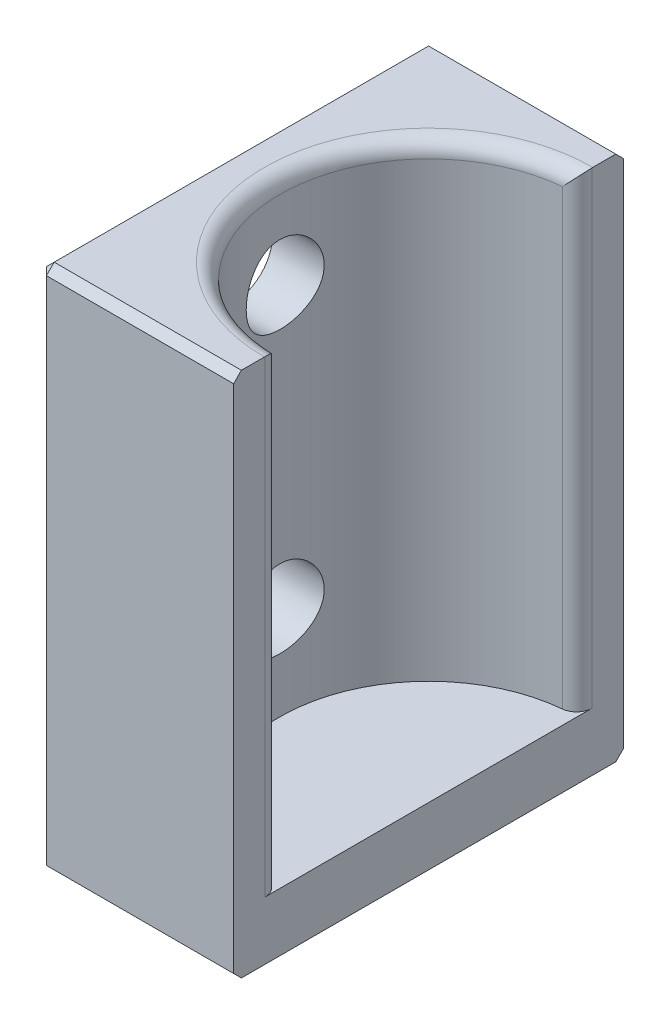
ISO-10303-21;
HEADER;
FILE_DESCRIPTION(('STEP AP214'),'2;1');
FILE_NAME('part.step','',(''),(''),'','','');
FILE_SCHEMA(('AUTOMOTIVE_DESIGN { 1 0 10303 214 1 1 1 1 }'));
ENDSEC;
DATA;
#1=APPLICATION_CONTEXT('core data for automotive mechanical design processes');
#2=APPLICATION_PROTOCOL_DEFINITION('international standard','automotive_design',2000,#1);
#3=PRODUCT_CONTEXT('',#1,'mechanical');
#4=PRODUCT('Part','Part','',(#3));
#5=PRODUCT_RELATED_PRODUCT_CATEGORY('part','',(#4));
#6=PRODUCT_DEFINITION_FORMATION('','',#4);
#7=PRODUCT_DEFINITION_CONTEXT('part definition',#1,'design');
#8=PRODUCT_DEFINITION('design','',#6,#7);
#9=PRODUCT_DEFINITION_SHAPE('','',#8);
#10=(LENGTH_UNIT() NAMED_UNIT(*) SI_UNIT(.MILLI.,.METRE.));
#11=(NAMED_UNIT(*) PLANE_ANGLE_UNIT() SI_UNIT($,.RADIAN.));
#12=(NAMED_UNIT(*) SI_UNIT($,.STERADIAN.) SOLID_ANGLE_UNIT());
#13=UNCERTAINTY_MEASURE_WITH_UNIT(LENGTH_MEASURE(1.E-05),#10,'distance_accuracy_value','');
#14=(GEOMETRIC_REPRESENTATION_CONTEXT(3) GLOBAL_UNCERTAINTY_ASSIGNED_CONTEXT((#13)) GLOBAL_UNIT_ASSIGNED_CONTEXT((#10,
#11,#12)) REPRESENTATION_CONTEXT('',''));
#15=CARTESIAN_POINT('',(0.,0.,0.));
#16=DIRECTION('',(0.,0.,1.));
#17=DIRECTION('',(1.,0.,0.));
#18=AXIS2_PLACEMENT_3D('',#15,#16,#17);
#19=CARTESIAN_POINT('',(-12.5,33.74,-12.5));
#20=DIRECTION('',(0.,0.,1.));
#21=DIRECTION('',(1.,0.,0.));
#22=AXIS2_PLACEMENT_3D('',#19,#20,#21);
#23=PLANE('',#22);
#24=DIRECTION('',(0.,1.,0.));
#25=VECTOR('',#24,1.);
#26=CARTESIAN_POINT('',(-12.,33.74,-12.5));
#27=LINE('',#26,#25);
#28=CARTESIAN_POINT('',(-12.,0.499999999999994,-12.5));
#29=VERTEX_POINT('',#28);
#30=CARTESIAN_POINT('',(-12.,33.24,-12.5));
#31=VERTEX_POINT('',#30);
#32=EDGE_CURVE('E384',#29,#31,#27,.T.);
#33=ORIENTED_EDGE('',*,*,#32,.T.);
#34=DIRECTION('',(1.,0.,0.));
#35=VECTOR('',#34,1.);
#36=CARTESIAN_POINT('',(-12.5,33.24,-12.5));
#37=LINE('',#36,#35);
#38=CARTESIAN_POINT('',(0.,33.24,-12.5));
#39=VERTEX_POINT('',#38);
#40=EDGE_CURVE('E381',#31,#39,#37,.T.);
#41=ORIENTED_EDGE('',*,*,#40,.T.);
#42=DIRECTION('',(0.,1.,0.));
#43=VECTOR('',#42,1.);
#44=CARTESIAN_POINT('',(0.,0.,-12.5));
#45=LINE('',#44,#43);
#46=CARTESIAN_POINT('',(0.,0.499999999999994,-12.5));
#47=VERTEX_POINT('',#46);
#48=EDGE_CURVE('E422',#47,#39,#45,.T.);
#49=ORIENTED_EDGE('',*,*,#48,.F.);
#50=DIRECTION('',(-1.,0.,0.));
#51=VECTOR('',#50,1.);
#52=CARTESIAN_POINT('',(-12.5,0.499999999999994,-12.5));
#53=LINE('',#52,#51);
#54=EDGE_CURVE('E388',#47,#29,#53,.T.);
#55=ORIENTED_EDGE('',*,*,#54,.T.);
#56=EDGE_LOOP('',(#33,#41,#49,#55));
#57=FACE_BOUND('',#56,.T.);
#58=ADVANCED_FACE('F36',(#57),#23,.F.);
#59=CARTESIAN_POINT('',(-12.5,33.74,12.5));
#60=DIRECTION('',(1.,0.,0.));
#61=DIRECTION('',(0.,0.,-1.));
#62=AXIS2_PLACEMENT_3D('',#59,#60,#61);
#63=PLANE('',#62);
#64=DIRECTION('',(0.,0.,-1.));
#65=VECTOR('',#64,1.);
#66=CARTESIAN_POINT('',(-12.5,33.24,12.5));
#67=LINE('',#66,#65);
#68=CARTESIAN_POINT('',(-12.5,33.24,12.));
#69=VERTEX_POINT('',#68);
#70=CARTESIAN_POINT('',(-12.5,33.24,-12.));
#71=VERTEX_POINT('',#70);
#72=EDGE_CURVE('E162',#69,#71,#67,.T.);
#73=ORIENTED_EDGE('',*,*,#72,.T.);
#74=DIRECTION('',(0.,-1.,0.));
#75=VECTOR('',#74,1.);
#76=CARTESIAN_POINT('',(-12.5,33.74,-12.));
#77=LINE('',#76,#75);
#78=CARTESIAN_POINT('',(-12.5,0.499999999999994,-12.));
#79=VERTEX_POINT('',#78);
#80=EDGE_CURVE('E158',#71,#79,#77,.T.);
#81=ORIENTED_EDGE('',*,*,#80,.T.);
#82=DIRECTION('',(0.,0.,1.));
#83=VECTOR('',#82,1.);
#84=CARTESIAN_POINT('',(-12.5,0.499999999999994,12.5));
#85=LINE('',#84,#83);
#86=CARTESIAN_POINT('',(-12.5,0.499999999999994,12.));
#87=VERTEX_POINT('',#86);
#88=EDGE_CURVE('E151',#79,#87,#85,.T.);
#89=ORIENTED_EDGE('',*,*,#88,.T.);
#90=DIRECTION('',(0.,1.,0.));
#91=VECTOR('',#90,1.);
#92=CARTESIAN_POINT('',(-12.5,33.74,12.));
#93=LINE('',#92,#91);
#94=EDGE_CURVE('E155',#87,#69,#93,.T.);
#95=ORIENTED_EDGE('',*,*,#94,.T.);
#96=EDGE_LOOP('',(#73,#81,#89,#95));
#97=FACE_BOUND('',#96,.T.);
#98=CARTESIAN_POINT('',(-12.5,27.74,0.));
#99=DIRECTION('',(-1.,0.,0.));
#100=DIRECTION('',(0.,0.,1.));
#101=AXIS2_PLACEMENT_3D('',#98,#99,#100);
#102=CIRCLE('',#101,2.5);
#103=CARTESIAN_POINT('',(-12.5,27.74,2.5));
#104=VERTEX_POINT('',#103);
#105=EDGE_CURVE('E434',#104,#104,#102,.T.);
#106=ORIENTED_EDGE('',*,*,#105,.F.);
#107=EDGE_LOOP('',(#106));
#108=FACE_BOUND('',#107,.T.);
#109=CARTESIAN_POINT('',(-12.5,9.73999999999999,0.));
#110=DIRECTION('',(-1.,0.,0.));
#111=DIRECTION('',(0.,0.,-1.));
#112=AXIS2_PLACEMENT_3D('',#109,#110,#111);
#113=CIRCLE('',#112,2.5);
#114=CARTESIAN_POINT('',(-12.5,9.73999999999999,-2.5));
#115=VERTEX_POINT('',#114);
#116=EDGE_CURVE('E200',#115,#115,#113,.T.);
#117=ORIENTED_EDGE('',*,*,#116,.F.);
#118=EDGE_LOOP('',(#117));
#119=FACE_BOUND('',#118,.T.);
#120=ADVANCED_FACE('F153',(#97,#108,#119),#63,.F.);
#121=CARTESIAN_POINT('',(-12.5,33.74,12.5));
#122=DIRECTION('',(0.,0.,-1.));
#123=DIRECTION('',(-1.,0.,0.));
#124=AXIS2_PLACEMENT_3D('',#121,#122,#123);
#125=PLANE('',#124);
#126=DIRECTION('',(0.,-1.,0.));
#127=VECTOR('',#126,1.);
#128=CARTESIAN_POINT('',(-12.,33.74,12.5));
#129=LINE('',#128,#127);
#130=CARTESIAN_POINT('',(-12.,33.24,12.5));
#131=VERTEX_POINT('',#130);
#132=CARTESIAN_POINT('',(-12.,0.5,12.5));
#133=VERTEX_POINT('',#132);
#134=EDGE_CURVE('E359',#131,#133,#129,.T.);
#135=ORIENTED_EDGE('',*,*,#134,.T.);
#136=DIRECTION('',(1.,0.,0.));
#137=VECTOR('',#136,1.);
#138=CARTESIAN_POINT('',(0.,0.5,12.5));
#139=LINE('',#138,#137);
#140=CARTESIAN_POINT('',(0.,0.5,12.5));
#141=VERTEX_POINT('',#140);
#142=EDGE_CURVE('E204',#133,#141,#139,.T.);
#143=ORIENTED_EDGE('',*,*,#142,.T.);
#144=DIRECTION('',(0.,1.,0.));
#145=VECTOR('',#144,1.);
#146=CARTESIAN_POINT('',(0.,0.,12.5));
#147=LINE('',#146,#145);
#148=CARTESIAN_POINT('',(0.,33.24,12.5));
#149=VERTEX_POINT('',#148);
#150=EDGE_CURVE('E420',#141,#149,#147,.T.);
#151=ORIENTED_EDGE('',*,*,#150,.T.);
#152=DIRECTION('',(-1.,0.,0.));
#153=VECTOR('',#152,1.);
#154=CARTESIAN_POINT('',(-12.5,33.24,12.5));
#155=LINE('',#154,#153);
#156=EDGE_CURVE('E338',#149,#131,#155,.T.);
#157=ORIENTED_EDGE('',*,*,#156,.T.);
#158=EDGE_LOOP('',(#135,#143,#151,#157));
#159=FACE_BOUND('',#158,.T.);
#160=ADVANCED_FACE('F244',(#159),#125,.F.);
#161=CARTESIAN_POINT('',(0.,33.74,0.));
#162=DIRECTION('',(0.,-1.,0.));
#163=DIRECTION('',(0.,0.,-1.));
#164=AXIS2_PLACEMENT_3D('',#161,#162,#163);
#165=PLANE('',#164);
#166=DIRECTION('',(0.,0.,1.));
#167=VECTOR('',#166,1.);
#168=CARTESIAN_POINT('',(0.,33.74,-12.5));
#169=LINE('',#168,#167);
#170=CARTESIAN_POINT('',(0.,33.74,10.525));
#171=VERTEX_POINT('',#170);
#172=CARTESIAN_POINT('',(0.,33.74,12.));
#173=VERTEX_POINT('',#172);
#174=EDGE_CURVE('E397',#171,#173,#169,.T.);
#175=ORIENTED_EDGE('',*,*,#174,.F.);
#176=CARTESIAN_POINT('',(0.,33.74,0.));
#177=DIRECTION('',(0.,-1.,0.));
#178=DIRECTION('',(0.,0.,-1.));
#179=AXIS2_PLACEMENT_3D('',#176,#177,#178);
#180=CIRCLE('',#179,10.525);
#181=CARTESIAN_POINT('',(0.,33.74,-10.525));
#182=VERTEX_POINT('',#181);
#183=EDGE_CURVE('E216',#171,#182,#180,.T.);
#184=ORIENTED_EDGE('',*,*,#183,.T.);
#185=CARTESIAN_POINT('',(0.,33.74,-12.));
#186=VERTEX_POINT('',#185);
#187=EDGE_CURVE('E400',#186,#182,#169,.T.);
#188=ORIENTED_EDGE('',*,*,#187,.F.);
#189=DIRECTION('',(-1.,0.,0.));
#190=VECTOR('',#189,1.);
#191=CARTESIAN_POINT('',(0.,33.74,-12.));
#192=LINE('',#191,#190);
#193=CARTESIAN_POINT('',(-12.,33.74,-12.));
#194=VERTEX_POINT('',#193);
#195=EDGE_CURVE('E342',#186,#194,#192,.T.);
#196=ORIENTED_EDGE('',*,*,#195,.T.);
#197=DIRECTION('',(0.,0.,1.));
#198=VECTOR('',#197,1.);
#199=CARTESIAN_POINT('',(-12.,33.74,0.));
#200=LINE('',#199,#198);
#201=CARTESIAN_POINT('',(-12.,33.74,12.));
#202=VERTEX_POINT('',#201);
#203=EDGE_CURVE('E346',#194,#202,#200,.T.);
#204=ORIENTED_EDGE('',*,*,#203,.T.);
#205=DIRECTION('',(1.,0.,0.));
#206=VECTOR('',#205,1.);
#207=CARTESIAN_POINT('',(0.,33.74,12.));
#208=LINE('',#207,#206);
#209=EDGE_CURVE('E337',#202,#173,#208,.T.);
#210=ORIENTED_EDGE('',*,*,#209,.T.);
#211=EDGE_LOOP('',(#175,#184,#188,#196,#204,#210));
#212=FACE_BOUND('',#211,.T.);
#213=ADVANCED_FACE('F396',(#212),#165,.F.);
#214=CARTESIAN_POINT('',(0.,0.,0.));
#215=DIRECTION('',(0.,-1.,0.));
#216=DIRECTION('',(0.,0.,-1.));
#217=AXIS2_PLACEMENT_3D('',#214,#215,#216);
#218=PLANE('',#217);
#219=DIRECTION('',(0.,0.,-1.));
#220=VECTOR('',#219,1.);
#221=CARTESIAN_POINT('',(-12.,0.,-12.5));
#222=LINE('',#221,#220);
#223=CARTESIAN_POINT('',(-12.,0.,12.));
#224=VERTEX_POINT('',#223);
#225=CARTESIAN_POINT('',(-12.,0.,-12.));
#226=VERTEX_POINT('',#225);
#227=EDGE_CURVE('E184',#224,#226,#222,.T.);
#228=ORIENTED_EDGE('',*,*,#227,.T.);
#229=DIRECTION('',(1.,0.,0.));
#230=VECTOR('',#229,1.);
#231=CARTESIAN_POINT('',(0.,0.,-12.));
#232=LINE('',#231,#230);
#233=CARTESIAN_POINT('',(0.,0.,-12.));
#234=VERTEX_POINT('',#233);
#235=EDGE_CURVE('E356',#226,#234,#232,.T.);
#236=ORIENTED_EDGE('',*,*,#235,.T.);
#237=DIRECTION('',(0.,0.,1.));
#238=VECTOR('',#237,1.);
#239=CARTESIAN_POINT('',(0.,0.,-12.5));
#240=LINE('',#239,#238);
#241=CARTESIAN_POINT('',(0.,0.,12.));
#242=VERTEX_POINT('',#241);
#243=EDGE_CURVE('E476',#234,#242,#240,.T.);
#244=ORIENTED_EDGE('',*,*,#243,.T.);
#245=DIRECTION('',(-1.,0.,0.));
#246=VECTOR('',#245,1.);
#247=CARTESIAN_POINT('',(-12.5,0.,12.));
#248=LINE('',#247,#246);
#249=EDGE_CURVE('E353',#242,#224,#248,.T.);
#250=ORIENTED_EDGE('',*,*,#249,.T.);
#251=EDGE_LOOP('',(#228,#236,#244,#250));
#252=FACE_BOUND('',#251,.T.);
#253=ADVANCED_FACE('F451',(#252),#218,.T.);
#254=CARTESIAN_POINT('',(0.,3.74,0.));
#255=DIRECTION('',(0.,1.,0.));
#256=DIRECTION('',(0.,0.,1.));
#257=AXIS2_PLACEMENT_3D('',#254,#255,#256);
#258=CYLINDRICAL_SURFACE('',#257,9.525);
#259=CARTESIAN_POINT('',(-9.19106223458421,27.74,2.5));
#260=CARTESIAN_POINT('',(-9.19106469671783,27.877805380667,2.49999651630335));
#261=CARTESIAN_POINT('',(-9.19419536524864,28.0156480493766,2.48856698911158));
#262=CARTESIAN_POINT('',(-9.20634374047816,28.2873582807851,2.44323395975473));
#263=CARTESIAN_POINT('',(-9.21536452143121,28.4212237294672,2.40931872137328));
#264=CARTESIAN_POINT('',(-9.2382026550406,28.6810097681014,2.32020118152029));
#265=CARTESIAN_POINT('',(-9.25201340372133,28.8069410159984,2.26502817678528));
#266=CARTESIAN_POINT('',(-9.28286698075181,29.0477780973584,2.13505240585555));
#267=CARTESIAN_POINT('',(-9.29991003121361,29.1626831723252,2.06024829054647));
#268=CARTESIAN_POINT('',(-9.33577063144502,29.3809910868909,1.89119561005043));
#269=CARTESIAN_POINT('',(-9.3546188535647,29.4840871617865,1.79655732671428));
#270=CARTESIAN_POINT('',(-9.3917009954108,29.67314112602,1.59136122600481));
#271=CARTESIAN_POINT('',(-9.40993485294923,29.7590972847043,1.4808018029795));
#272=CARTESIAN_POINT('',(-9.44407532289643,29.9127044222748,1.24478124331787));
#273=CARTESIAN_POINT('',(-9.45994152894907,29.9800513579571,1.11911587703889));
#274=CARTESIAN_POINT('',(-9.48720758730729,30.092546994093,0.857760542880184));
#275=CARTESIAN_POINT('',(-9.49860816828216,30.1376993164142,0.722072214775205));
#276=CARTESIAN_POINT('',(-9.51544156977354,30.2035338294754,0.447723648627484));
#277=CARTESIAN_POINT('',(-9.52100140611609,30.2247376221179,0.309196507162029));
#278=CARTESIAN_POINT('',(-9.52597058957104,30.2437132599066,0.0304471293071448));
#279=CARTESIAN_POINT('',(-9.52538093515139,30.2414889089851,-0.109774828209026));
#280=CARTESIAN_POINT('',(-9.51821102208942,30.2140407338657,-0.384306232903461));
#281=CARTESIAN_POINT('',(-9.51177751894229,30.1893803182477,-0.518676426459472));
#282=CARTESIAN_POINT('',(-9.49381536195328,30.1186690550938,-0.781300207566573));
#283=CARTESIAN_POINT('',(-9.48228642225872,30.0726170074855,-0.909553451511081));
#284=CARTESIAN_POINT('',(-9.45520936119211,29.9599917598536,-1.15775281714907));
#285=CARTESIAN_POINT('',(-9.43962329369205,29.8932236058906,-1.27760616489887));
#286=CARTESIAN_POINT('',(-9.40611425532938,29.7412106226262,-1.50460091650506));
#287=CARTESIAN_POINT('',(-9.38819084162893,29.6559622900046,-1.61173990411027));
#288=CARTESIAN_POINT('',(-9.35132281482883,29.4664103478985,-1.81362691900899));
#289=CARTESIAN_POINT('',(-9.33236368507222,29.3616150839522,-1.90791120855082));
#290=CARTESIAN_POINT('',(-9.2960441466663,29.1375037177246,-2.07767804040785));
#291=CARTESIAN_POINT('',(-9.27868382934782,29.0181867868078,-2.15315950904694));
#292=CARTESIAN_POINT('',(-9.24747084091809,28.7674383061663,-2.28351644622864));
#293=CARTESIAN_POINT('',(-9.23363914174682,28.6359403793851,-2.33826960831188));
#294=CARTESIAN_POINT('',(-9.21131205881438,28.3651528934427,-2.42474154648091));
#295=CARTESIAN_POINT('',(-9.20281539912949,28.2258652059595,-2.45646583041803));
#296=CARTESIAN_POINT('',(-9.19239121862609,27.9477797099532,-2.49518779718754));
#297=CARTESIAN_POINT('',(-9.19028039169482,27.8090847694254,-2.50287567086191));
#298=CARTESIAN_POINT('',(-9.19236601037381,27.5323917871216,-2.49520508643));
#299=CARTESIAN_POINT('',(-9.19656180844586,27.3943936752578,-2.47984899438321));
#300=CARTESIAN_POINT('',(-9.21061121366575,27.1256459011069,-2.42713401203908));
#301=CARTESIAN_POINT('',(-9.22035891930024,26.9948094477043,-2.39018663716803));
#302=CARTESIAN_POINT('',(-9.24431111095941,26.7411896037596,-2.29579892544996));
#303=CARTESIAN_POINT('',(-9.25851616537598,26.6184072426743,-2.23835597492143));
#304=CARTESIAN_POINT('',(-9.2901612358676,26.3814838244939,-2.10319536668792));
#305=CARTESIAN_POINT('',(-9.30766391896881,26.2675836255943,-2.02507051528441));
#306=CARTESIAN_POINT('',(-9.34378308974656,26.0542562258842,-1.85127112066927));
#307=CARTESIAN_POINT('',(-9.36239977959191,25.9548316634057,-1.75559338542987));
#308=CARTESIAN_POINT('',(-9.39927786841089,25.7704306266202,-1.54621811097832));
#309=CARTESIAN_POINT('',(-9.41751487521746,25.6859344768405,-1.43209240369362));
#310=CARTESIAN_POINT('',(-9.45104474641045,25.5373012368587,-1.1908749638829));
#311=CARTESIAN_POINT('',(-9.46633776713962,25.4731630654125,-1.06378392044015));
#312=CARTESIAN_POINT('',(-9.49215832795568,25.3676479809616,-0.801136204232731));
#313=CARTESIAN_POINT('',(-9.50272107587817,25.3261023949463,-0.665650921019944));
#314=CARTESIAN_POINT('',(-9.51804571346392,25.2664576569173,-0.389304413350333));
#315=CARTESIAN_POINT('',(-9.52280884552231,25.2483534832258,-0.248444346951345));
#316=CARTESIAN_POINT('',(-9.52594095151323,25.2364118727673,0.0301595122355531));
#317=CARTESIAN_POINT('',(-9.52449586601004,25.2418687894308,0.167871404466949));
#318=CARTESIAN_POINT('',(-9.51579230125348,25.2752617289089,0.440344435592056));
#319=CARTESIAN_POINT('',(-9.50853402822096,25.3031969543133,0.57510567898481));
#320=CARTESIAN_POINT('',(-9.48905447985021,25.3803596408,0.837031488405949));
#321=CARTESIAN_POINT('',(-9.47686567932715,25.4294479132955,0.964239633541223));
#322=CARTESIAN_POINT('',(-9.4488018447247,25.5473986111918,1.20868668315975));
#323=CARTESIAN_POINT('',(-9.43292630649389,25.6162637413295,1.32592422119111));
#324=CARTESIAN_POINT('',(-9.39867611913775,25.7739009200188,1.55040317248687));
#325=CARTESIAN_POINT('',(-9.38024725825729,25.8631436711592,1.65730575368075));
#326=CARTESIAN_POINT('',(-9.34319295861769,26.0581046452437,1.85485689302006));
#327=CARTESIAN_POINT('',(-9.32456746989626,26.1638271543732,1.94550120935968));
#328=CARTESIAN_POINT('',(-9.28877718764883,26.3914328483708,2.10985382999903));
#329=CARTESIAN_POINT('',(-9.27165154261029,26.5136101399254,2.18316410006038));
#330=CARTESIAN_POINT('',(-9.24134569862471,26.7689898220301,2.30809776105784));
#331=CARTESIAN_POINT('',(-9.22816284486072,26.9021847165584,2.35973575417369));
#332=CARTESIAN_POINT('',(-9.20912537607401,27.1524643155942,2.43285817581199));
#333=CARTESIAN_POINT('',(-9.20240549628642,27.2684338139755,2.4579783582096));
#334=CARTESIAN_POINT('',(-9.19337310015429,27.5029265243657,2.4915498850249));
#335=CARTESIAN_POINT('',(-9.19106011647199,27.6214494642419,2.50000299693744));
#336=CARTESIAN_POINT('',(-9.19106223458421,27.74,2.5));
#337=B_SPLINE_CURVE_WITH_KNOTS('',3,(#259,#260,#261,#262,#263,#264,#265,#266,#267,#268,#269,
#270,#271,#272,#273,#274,#275,#276,#277,#278,#279,#280,#281,#282,#283,#284,#285,#286,#287,#288,
#289,#290,#291,#292,#293,#294,#295,#296,#297,#298,#299,#300,#301,#302,#303,#304,#305,#306,#307,
#308,#309,#310,#311,#312,#313,#314,#315,#316,#317,#318,#319,#320,#321,#322,#323,#324,#325,#326,
#327,#328,#329,#330,#331,#332,#333,#334,#335,#336),.UNSPECIFIED.,.T.,.F.,(4,2,2,2,2,2,2,2,2,2,2,
2,2,2,2,2,2,2,2,2,2,2,2,2,2,2,2,2,2,2,2,2,2,2,2,2,2,2,4),(0.,0.412980364300906,
0.826176449889436,1.23880510778357,1.6514621303029,2.07315025475375,2.49488093640762,
2.92314164454474,3.3513324429721,3.77000562874106,4.18861083729642,4.59698582695746,
5.00538372925882,5.417747914411,5.83019034064113,6.25490912606284,6.67965215816201,
7.10686369143112,7.5339730141816,7.94869990764461,8.36338422157175,8.77041142636264,
9.17749055552711,9.59327253122647,10.0091301928111,10.436586743212,10.8640205869238,
11.2882178596807,11.7123242447968,12.1238183210893,12.5352978004165,12.9441100967508,
13.3529783300157,13.7724690121704,14.1920689813797,14.6205291513118,15.0487001713948,
15.4040145720673,15.7592912906431),.UNSPECIFIED.);
#338=CARTESIAN_POINT('',(-9.19106223458421,27.74,2.5));
#339=VERTEX_POINT('',#338);
#340=EDGE_CURVE('E401',#339,#339,#337,.T.);
#341=ORIENTED_EDGE('',*,*,#340,.T.);
#342=EDGE_LOOP('',(#341));
#343=FACE_BOUND('',#342,.T.);
#344=CARTESIAN_POINT('',(-9.19106223458421,9.73999999999999,2.5));
#345=CARTESIAN_POINT('',(-9.19106469671783,9.87780538066695,2.49999651630335));
#346=CARTESIAN_POINT('',(-9.19419536524864,10.0156480493766,2.48856698911158));
#347=CARTESIAN_POINT('',(-9.20634374047816,10.2873582807851,2.44323395975473));
#348=CARTESIAN_POINT('',(-9.21536452143121,10.4212237294672,2.40931872137328));
#349=CARTESIAN_POINT('',(-9.2382026550406,10.6810097681014,2.32020118152029));
#350=CARTESIAN_POINT('',(-9.25201340372133,10.8069410159984,2.26502817678528));
#351=CARTESIAN_POINT('',(-9.28286698075181,11.0477780973584,2.13505240585555));
#352=CARTESIAN_POINT('',(-9.29991003121361,11.1626831723252,2.06024829054647));
#353=CARTESIAN_POINT('',(-9.33577063144502,11.3809910868909,1.89119561005043));
#354=CARTESIAN_POINT('',(-9.3546188535647,11.4840871617865,1.79655732671428));
#355=CARTESIAN_POINT('',(-9.3917009954108,11.6731411260199,1.59136122600481));
#356=CARTESIAN_POINT('',(-9.40993485294923,11.7590972847043,1.4808018029795));
#357=CARTESIAN_POINT('',(-9.44407532289642,11.9127044222748,1.24478124331787));
#358=CARTESIAN_POINT('',(-9.45994152894907,11.9800513579571,1.11911587703889));
#359=CARTESIAN_POINT('',(-9.48720758730729,12.0925469940929,0.857760542880181));
#360=CARTESIAN_POINT('',(-9.49860816828216,12.1376993164142,0.722072214775203));
#361=CARTESIAN_POINT('',(-9.51544156977354,12.2035338294754,0.447723648627483));
#362=CARTESIAN_POINT('',(-9.52100140611609,12.2247376221179,0.309196507162028));
#363=CARTESIAN_POINT('',(-9.52597058957104,12.2437132599066,0.0304471293071423));
#364=CARTESIAN_POINT('',(-9.52538093515139,12.2414889089851,-0.10977482820903));
#365=CARTESIAN_POINT('',(-9.51821102208942,12.2140407338657,-0.384306232903464));
#366=CARTESIAN_POINT('',(-9.51177751894229,12.1893803182477,-0.518676426459476));
#367=CARTESIAN_POINT('',(-9.49381536195328,12.1186690550938,-0.781300207566576));
#368=CARTESIAN_POINT('',(-9.48228642225872,12.0726170074855,-0.909553451511084));
#369=CARTESIAN_POINT('',(-9.45520936119211,11.9599917598536,-1.15775281714907));
#370=CARTESIAN_POINT('',(-9.43962329369205,11.8932236058906,-1.27760616489887));
#371=CARTESIAN_POINT('',(-9.40611425532938,11.7412106226262,-1.50460091650506));
#372=CARTESIAN_POINT('',(-9.38819084162893,11.6559622900046,-1.61173990411027));
#373=CARTESIAN_POINT('',(-9.35132281482883,11.4664103478985,-1.81362691900899));
#374=CARTESIAN_POINT('',(-9.33236368507222,11.3616150839522,-1.90791120855082));
#375=CARTESIAN_POINT('',(-9.2960441466663,11.1375037177246,-2.07767804040785));
#376=CARTESIAN_POINT('',(-9.27868382934782,11.0181867868078,-2.15315950904694));
#377=CARTESIAN_POINT('',(-9.24747084091809,10.7674383061663,-2.28351644622864));
#378=CARTESIAN_POINT('',(-9.23363914174682,10.6359403793851,-2.33826960831188));
#379=CARTESIAN_POINT('',(-9.21131205881438,10.3651528934427,-2.42474154648091));
#380=CARTESIAN_POINT('',(-9.20281539912948,10.2258652059595,-2.45646583041804));
#381=CARTESIAN_POINT('',(-9.19239121862609,9.94777970995323,-2.49518779718754));
#382=CARTESIAN_POINT('',(-9.19028039169482,9.80908476942543,-2.50287567086191));
#383=CARTESIAN_POINT('',(-9.19236601037381,9.53239178712162,-2.49520508643));
#384=CARTESIAN_POINT('',(-9.19656180844587,9.39439367525778,-2.47984899438321));
#385=CARTESIAN_POINT('',(-9.21061121366575,9.1256459011069,-2.42713401203908));
#386=CARTESIAN_POINT('',(-9.22035891930024,8.99480944770427,-2.39018663716803));
#387=CARTESIAN_POINT('',(-9.24431111095941,8.7411896037596,-2.29579892544996));
#388=CARTESIAN_POINT('',(-9.25851616537598,8.61840724267431,-2.23835597492143));
#389=CARTESIAN_POINT('',(-9.2901612358676,8.38148382449386,-2.10319536668792));
#390=CARTESIAN_POINT('',(-9.30766391896881,8.26758362559427,-2.0250705152844));
#391=CARTESIAN_POINT('',(-9.34378308974656,8.05425622588417,-1.85127112066926));
#392=CARTESIAN_POINT('',(-9.36239977959191,7.9548316634057,-1.75559338542987));
#393=CARTESIAN_POINT('',(-9.39927786841089,7.77043062662018,-1.54621811097832));
#394=CARTESIAN_POINT('',(-9.41751487521746,7.68593447684045,-1.43209240369362));
#395=CARTESIAN_POINT('',(-9.45104474641045,7.53730123685873,-1.1908749638829));
#396=CARTESIAN_POINT('',(-9.46633776713962,7.47316306541253,-1.06378392044015));
#397=CARTESIAN_POINT('',(-9.49215832795568,7.36764798096157,-0.801136204232729));
#398=CARTESIAN_POINT('',(-9.50272107587817,7.32610239494624,-0.665650921019941));
#399=CARTESIAN_POINT('',(-9.51804571346392,7.26645765691726,-0.38930441335033));
#400=CARTESIAN_POINT('',(-9.52280884552231,7.24835348322579,-0.248444346951342));
#401=CARTESIAN_POINT('',(-9.52594095151323,7.23641187276725,0.0301595122355566));
#402=CARTESIAN_POINT('',(-9.52449586601004,7.24186878943082,0.167871404466953));
#403=CARTESIAN_POINT('',(-9.51579230125348,7.27526172890893,0.44034443559206));
#404=CARTESIAN_POINT('',(-9.50853402822096,7.30319695431332,0.575105678984813));
#405=CARTESIAN_POINT('',(-9.48905447985021,7.38035964079995,0.837031488405951));
#406=CARTESIAN_POINT('',(-9.47686567932714,7.42944791329552,0.964239633541225));
#407=CARTESIAN_POINT('',(-9.4488018447247,7.54739861119183,1.20868668315976));
#408=CARTESIAN_POINT('',(-9.43292630649389,7.61626374132949,1.32592422119111));
#409=CARTESIAN_POINT('',(-9.39867611913775,7.77390092001875,1.55040317248687));
#410=CARTESIAN_POINT('',(-9.38024725825729,7.86314367115923,1.65730575368075));
#411=CARTESIAN_POINT('',(-9.34319295861769,8.05810464524371,1.85485689302006));
#412=CARTESIAN_POINT('',(-9.32456746989626,8.16382715437323,1.94550120935968));
#413=CARTESIAN_POINT('',(-9.28877718764883,8.39143284837083,2.10985382999902));
#414=CARTESIAN_POINT('',(-9.27165154261029,8.51361013992537,2.18316410006038));
#415=CARTESIAN_POINT('',(-9.24134569862471,8.76898982203006,2.30809776105783));
#416=CARTESIAN_POINT('',(-9.22816284486072,8.90218471655836,2.35973575417369));
#417=CARTESIAN_POINT('',(-9.209125376074,9.15246431559421,2.43285817581199));
#418=CARTESIAN_POINT('',(-9.20240549628642,9.26843381397545,2.4579783582096));
#419=CARTESIAN_POINT('',(-9.19337310015429,9.50292652436573,2.4915498850249));
#420=CARTESIAN_POINT('',(-9.19106011647199,9.62144946424188,2.50000299693744));
#421=CARTESIAN_POINT('',(-9.19106223458421,9.73999999999999,2.5));
#422=B_SPLINE_CURVE_WITH_KNOTS('',3,(#344,#345,#346,#347,#348,#349,#350,#351,#352,#353,#354,
#355,#356,#357,#358,#359,#360,#361,#362,#363,#364,#365,#366,#367,#368,#369,#370,#371,#372,#373,
#374,#375,#376,#377,#378,#379,#380,#381,#382,#383,#384,#385,#386,#387,#388,#389,#390,#391,#392,
#393,#394,#395,#396,#397,#398,#399,#400,#401,#402,#403,#404,#405,#406,#407,#408,#409,#410,#411,
#412,#413,#414,#415,#416,#417,#418,#419,#420,#421),.UNSPECIFIED.,.T.,.F.,(4,2,2,2,2,2,2,2,2,2,2,
2,2,2,2,2,2,2,2,2,2,2,2,2,2,2,2,2,2,2,2,2,2,2,2,2,2,2,4),(0.,0.412980364300904,
0.826176449889438,1.23880510778358,1.65146213030291,2.07315025475375,2.49488093640762,
2.92314164454474,3.3513324429721,3.77000562874106,4.18861083729642,4.59698582695746,
5.00538372925883,5.417747914411,5.83019034064113,6.25490912606284,6.67965215816201,
7.10686369143113,7.53397301418161,7.94869990764462,8.36338422157175,8.77041142636264,
9.17749055552712,9.59327253122647,10.0091301928111,10.436586743212,10.8640205869238,
11.2882178596807,11.7123242447968,12.1238183210893,12.5352978004165,12.9441100967508,
13.3529783300157,13.7724690121704,14.1920689813797,14.6205291513118,15.0487001713948,
15.4040145720673,15.7592912906431),.UNSPECIFIED.);
#423=CARTESIAN_POINT('',(-9.19106223458421,9.73999999999999,2.5));
#424=VERTEX_POINT('',#423);
#425=EDGE_CURVE('E426',#424,#424,#422,.T.);
#426=ORIENTED_EDGE('',*,*,#425,.T.);
#427=EDGE_LOOP('',(#426));
#428=FACE_BOUND('',#427,.T.);
#429=CARTESIAN_POINT('',(0.,3.74,0.));
#430=DIRECTION('',(0.,1.,0.));
#431=DIRECTION('',(0.,0.,1.));
#432=AXIS2_PLACEMENT_3D('',#429,#430,#431);
#433=CIRCLE('',#432,9.525);
#434=CARTESIAN_POINT('',(-0.90498812351544,3.74,-9.48191022401583));
#435=VERTEX_POINT('',#434);
#436=CARTESIAN_POINT('',(-0.90498812351544,3.74,9.48191022401583));
#437=VERTEX_POINT('',#436);
#438=EDGE_CURVE('E412',#435,#437,#433,.T.);
#439=ORIENTED_EDGE('',*,*,#438,.F.);
#440=DIRECTION('',(0.,1.,0.));
#441=VECTOR('',#440,1.);
#442=CARTESIAN_POINT('',(-0.90498812351544,3.74,-9.48191022401583));
#443=LINE('',#442,#441);
#444=CARTESIAN_POINT('',(-0.90498812351544,32.74,-9.48191022401583));
#445=VERTEX_POINT('',#444);
#446=EDGE_CURVE('E207',#435,#445,#443,.T.);
#447=ORIENTED_EDGE('',*,*,#446,.T.);
#448=CARTESIAN_POINT('',(0.,32.74,0.));
#449=DIRECTION('',(0.,-1.,0.));
#450=DIRECTION('',(0.,0.,-1.));
#451=AXIS2_PLACEMENT_3D('',#448,#449,#450);
#452=CIRCLE('',#451,9.525);
#453=CARTESIAN_POINT('',(-0.90498812351544,32.74,9.48191022401583));
#454=VERTEX_POINT('',#453);
#455=EDGE_CURVE('E203',#445,#454,#452,.F.);
#456=ORIENTED_EDGE('',*,*,#455,.T.);
#457=DIRECTION('',(0.,1.,0.));
#458=VECTOR('',#457,1.);
#459=CARTESIAN_POINT('',(-0.90498812351544,3.74,9.48191022401583));
#460=LINE('',#459,#458);
#461=EDGE_CURVE('E201',#454,#437,#460,.F.);
#462=ORIENTED_EDGE('',*,*,#461,.T.);
#463=EDGE_LOOP('',(#439,#447,#456,#462));
#464=FACE_BOUND('',#463,.T.);
#465=ADVANCED_FACE('F419',(#343,#428,#464),#258,.F.);
#466=CARTESIAN_POINT('',(0.,3.74,0.));
#467=DIRECTION('',(0.,1.,0.));
#468=DIRECTION('',(0.,0.,1.));
#469=AXIS2_PLACEMENT_3D('',#466,#467,#468);
#470=PLANE('',#469);
#471=DIRECTION('',(0.,0.,1.));
#472=VECTOR('',#471,1.);
#473=CARTESIAN_POINT('',(0.,3.74,0.));
#474=LINE('',#473,#472);
#475=CARTESIAN_POINT('',(0.,3.74,-10.4773863630201));
#476=VERTEX_POINT('',#475);
#477=CARTESIAN_POINT('',(0.,3.74,10.4773863630201));
#478=VERTEX_POINT('',#477);
#479=EDGE_CURVE('E66',#476,#478,#474,.T.);
#480=ORIENTED_EDGE('',*,*,#479,.F.);
#481=CARTESIAN_POINT('',(-1.,3.74,-10.4773863630201));
#482=DIRECTION('',(0.,1.,0.));
#483=DIRECTION('',(0.,0.,1.));
#484=AXIS2_PLACEMENT_3D('',#481,#482,#483);
#485=CIRCLE('',#484,1.);
#486=EDGE_CURVE('E51',#476,#435,#485,.F.);
#487=ORIENTED_EDGE('',*,*,#486,.T.);
#488=ORIENTED_EDGE('',*,*,#438,.T.);
#489=CARTESIAN_POINT('',(-1.,3.74,10.4773863630201));
#490=DIRECTION('',(0.,1.,0.));
#491=DIRECTION('',(0.,0.,1.));
#492=AXIS2_PLACEMENT_3D('',#489,#490,#491);
#493=CIRCLE('',#492,1.);
#494=EDGE_CURVE('E11',#437,#478,#493,.F.);
#495=ORIENTED_EDGE('',*,*,#494,.T.);
#496=EDGE_LOOP('',(#480,#487,#488,#495));
#497=FACE_BOUND('',#496,.T.);
#498=ADVANCED_FACE('F415',(#497),#470,.T.);
#499=CARTESIAN_POINT('',(0.,0.,-12.5));
#500=DIRECTION('',(-1.,0.,0.));
#501=DIRECTION('',(0.,0.,1.));
#502=AXIS2_PLACEMENT_3D('',#499,#500,#501);
#503=PLANE('',#502);
#504=ORIENTED_EDGE('',*,*,#187,.T.);
#505=CARTESIAN_POINT('',(0.,32.74,-10.525));
#506=DIRECTION('',(-1.,0.,0.));
#507=DIRECTION('',(0.,0.,1.));
#508=AXIS2_PLACEMENT_3D('',#505,#506,#507);
#509=CIRCLE('',#508,1.);
#510=CARTESIAN_POINT('',(0.,33.7388658276133,-10.4773863630201));
#511=VERTEX_POINT('',#510);
#512=EDGE_CURVE('E59',#182,#511,#509,.F.);
#513=ORIENTED_EDGE('',*,*,#512,.T.);
#514=DIRECTION('',(0.,1.,0.));
#515=VECTOR('',#514,1.);
#516=CARTESIAN_POINT('',(0.,0.,-10.4773863630201));
#517=LINE('',#516,#515);
#518=EDGE_CURVE('E213',#511,#476,#517,.F.);
#519=ORIENTED_EDGE('',*,*,#518,.T.);
#520=ORIENTED_EDGE('',*,*,#479,.T.);
#521=DIRECTION('',(0.,1.,0.));
#522=VECTOR('',#521,1.);
#523=CARTESIAN_POINT('',(0.,0.,10.4773863630201));
#524=LINE('',#523,#522);
#525=CARTESIAN_POINT('',(0.,33.7388658276133,10.4773863630201));
#526=VERTEX_POINT('',#525);
#527=EDGE_CURVE('E209',#478,#526,#524,.T.);
#528=ORIENTED_EDGE('',*,*,#527,.T.);
#529=CARTESIAN_POINT('',(0.,32.74,10.525));
#530=DIRECTION('',(-1.,0.,0.));
#531=DIRECTION('',(0.,0.,1.));
#532=AXIS2_PLACEMENT_3D('',#529,#530,#531);
#533=CIRCLE('',#532,1.);
#534=EDGE_CURVE('E211',#526,#171,#533,.F.);
#535=ORIENTED_EDGE('',*,*,#534,.T.);
#536=ORIENTED_EDGE('',*,*,#174,.T.);
#537=DIRECTION('',(0.,0.70710678118655,-0.707106781186545));
#538=VECTOR('',#537,1.);
#539=CARTESIAN_POINT('',(0.,33.74,12.));
#540=LINE('',#539,#538);
#541=EDGE_CURVE('E334',#173,#149,#540,.F.);
#542=ORIENTED_EDGE('',*,*,#541,.T.);
#543=ORIENTED_EDGE('',*,*,#150,.F.);
#544=DIRECTION('',(0.,-0.70710678118655,-0.707106781186545));
#545=VECTOR('',#544,1.);
#546=CARTESIAN_POINT('',(0.,0.5,12.5));
#547=LINE('',#546,#545);
#548=EDGE_CURVE('E341',#141,#242,#547,.T.);
#549=ORIENTED_EDGE('',*,*,#548,.T.);
#550=ORIENTED_EDGE('',*,*,#243,.F.);
#551=DIRECTION('',(0.,0.707106781186543,-0.707106781186552));
#552=VECTOR('',#551,1.);
#553=CARTESIAN_POINT('',(0.,0.499999999999994,-12.5));
#554=LINE('',#553,#552);
#555=EDGE_CURVE('E344',#234,#47,#554,.T.);
#556=ORIENTED_EDGE('',*,*,#555,.T.);
#557=ORIENTED_EDGE('',*,*,#48,.T.);
#558=DIRECTION('',(0.,-0.70710678118655,-0.707106781186545));
#559=VECTOR('',#558,1.);
#560=CARTESIAN_POINT('',(0.,33.74,-12.));
#561=LINE('',#560,#559);
#562=EDGE_CURVE('E351',#39,#186,#561,.F.);
#563=ORIENTED_EDGE('',*,*,#562,.T.);
#564=EDGE_LOOP('',(#504,#513,#519,#520,#528,#535,#536,#542,#543,#549,#550,#556,#557,#563));
#565=FACE_BOUND('',#564,.T.);
#566=ADVANCED_FACE('F409',(#565),#503,.F.);
#567=CARTESIAN_POINT('',(0.,9.73999999999999,0.));
#568=DIRECTION('',(-1.,0.,0.));
#569=DIRECTION('',(0.,0.,1.));
#570=AXIS2_PLACEMENT_3D('',#567,#568,#569);
#571=CYLINDRICAL_SURFACE('',#570,2.5);
#572=ORIENTED_EDGE('',*,*,#116,.T.);
#573=EDGE_LOOP('',(#572));
#574=FACE_BOUND('',#573,.T.);
#575=ORIENTED_EDGE('',*,*,#425,.F.);
#576=EDGE_LOOP('',(#575));
#577=FACE_BOUND('',#576,.T.);
#578=ADVANCED_FACE('F328',(#574,#577),#571,.F.);
#579=CARTESIAN_POINT('',(0.,27.74,0.));
#580=DIRECTION('',(-1.,0.,0.));
#581=DIRECTION('',(0.,0.,1.));
#582=AXIS2_PLACEMENT_3D('',#579,#580,#581);
#583=CYLINDRICAL_SURFACE('',#582,2.5);
#584=ORIENTED_EDGE('',*,*,#105,.T.);
#585=EDGE_LOOP('',(#584));
#586=FACE_BOUND('',#585,.T.);
#587=ORIENTED_EDGE('',*,*,#340,.F.);
#588=EDGE_LOOP('',(#587));
#589=FACE_BOUND('',#588,.T.);
#590=ADVANCED_FACE('F323',(#586,#589),#583,.F.);
#591=CARTESIAN_POINT('',(0.,33.74,12.));
#592=DIRECTION('',(0.,-0.707106781186545,-0.70710678118655));
#593=DIRECTION('',(1.,0.,0.));
#594=AXIS2_PLACEMENT_3D('',#591,#592,#593);
#595=PLANE('',#594);
#596=ORIENTED_EDGE('',*,*,#541,.F.);
#597=ORIENTED_EDGE('',*,*,#209,.F.);
#598=DIRECTION('',(0.,-0.70710678118655,0.707106781186545));
#599=VECTOR('',#598,1.);
#600=CARTESIAN_POINT('',(-12.,33.74,12.));
#601=LINE('',#600,#599);
#602=EDGE_CURVE('E197',#131,#202,#601,.F.);
#603=ORIENTED_EDGE('',*,*,#602,.F.);
#604=ORIENTED_EDGE('',*,*,#156,.F.);
#605=EDGE_LOOP('',(#596,#597,#603,#604));
#606=FACE_BOUND('',#605,.T.);
#607=ADVANCED_FACE('F319',(#606),#595,.F.);
#608=CARTESIAN_POINT('',(-12.,33.74,12.5));
#609=DIRECTION('',(0.707106781186545,0.,-0.70710678118655));
#610=DIRECTION('',(0.,-1.,0.));
#611=AXIS2_PLACEMENT_3D('',#608,#609,#610);
#612=PLANE('',#611);
#613=DIRECTION('',(0.70710678118655,0.,0.707106781186545));
#614=VECTOR('',#613,1.);
#615=CARTESIAN_POINT('',(-12.5,0.499999999999994,12.));
#616=LINE('',#615,#614);
#617=EDGE_CURVE('E169',#133,#87,#616,.F.);
#618=ORIENTED_EDGE('',*,*,#617,.F.);
#619=ORIENTED_EDGE('',*,*,#134,.F.);
#620=DIRECTION('',(-0.70710678118655,0.,-0.707106781186545));
#621=VECTOR('',#620,1.);
#622=CARTESIAN_POINT('',(-12.25,33.24,12.25));
#623=LINE('',#622,#621);
#624=EDGE_CURVE('E172',#69,#131,#623,.F.);
#625=ORIENTED_EDGE('',*,*,#624,.F.);
#626=ORIENTED_EDGE('',*,*,#94,.F.);
#627=EDGE_LOOP('',(#618,#619,#625,#626));
#628=FACE_BOUND('',#627,.T.);
#629=ADVANCED_FACE('F167',(#628),#612,.F.);
#630=CARTESIAN_POINT('',(-12.5,0.5,12.5));
#631=DIRECTION('',(0.,-0.707106781186545,0.70710678118655));
#632=DIRECTION('',(-1.,0.,0.));
#633=AXIS2_PLACEMENT_3D('',#630,#631,#632);
#634=PLANE('',#633);
#635=ORIENTED_EDGE('',*,*,#548,.F.);
#636=ORIENTED_EDGE('',*,*,#142,.F.);
#637=DIRECTION('',(0.,0.70710678118655,0.707106781186545));
#638=VECTOR('',#637,1.);
#639=CARTESIAN_POINT('',(-12.,0.249999999999998,12.25));
#640=LINE('',#639,#638);
#641=EDGE_CURVE('E181',#224,#133,#640,.T.);
#642=ORIENTED_EDGE('',*,*,#641,.F.);
#643=ORIENTED_EDGE('',*,*,#249,.F.);
#644=EDGE_LOOP('',(#635,#636,#642,#643));
#645=FACE_BOUND('',#644,.T.);
#646=ADVANCED_FACE('F307',(#645),#634,.T.);
#647=CARTESIAN_POINT('',(-12.,33.74,12.));
#648=DIRECTION('',(-0.577350269189626,0.577350269189622,0.57735026918963));
#649=DIRECTION('',(0.70710678118655,0.,0.707106781186545));
#650=AXIS2_PLACEMENT_3D('',#647,#648,#649);
#651=PLANE('',#650);
#652=ORIENTED_EDGE('',*,*,#624,.T.);
#653=ORIENTED_EDGE('',*,*,#602,.T.);
#654=DIRECTION('',(0.707106781186545,0.70710678118655,0.));
#655=VECTOR('',#654,1.);
#656=CARTESIAN_POINT('',(-12.,33.74,12.));
#657=LINE('',#656,#655);
#658=EDGE_CURVE('E185',#69,#202,#657,.T.);
#659=ORIENTED_EDGE('',*,*,#658,.F.);
#660=EDGE_LOOP('',(#652,#653,#659));
#661=FACE_BOUND('',#660,.T.);
#662=ADVANCED_FACE('F301',(#661),#651,.T.);
#663=CARTESIAN_POINT('',(-12.5,0.499999999999994,12.));
#664=DIRECTION('',(-0.577350269189619,-0.577350269189627,0.577350269189631));
#665=DIRECTION('',(0.,-0.70710678118655,-0.707106781186545));
#666=AXIS2_PLACEMENT_3D('',#663,#664,#665);
#667=PLANE('',#666);
#668=ORIENTED_EDGE('',*,*,#641,.T.);
#669=ORIENTED_EDGE('',*,*,#617,.T.);
#670=DIRECTION('',(0.707106781186552,-0.707106781186543,0.));
#671=VECTOR('',#670,1.);
#672=CARTESIAN_POINT('',(-12.5,0.499999999999994,12.));
#673=LINE('',#672,#671);
#674=EDGE_CURVE('E178',#224,#87,#673,.F.);
#675=ORIENTED_EDGE('',*,*,#674,.F.);
#676=EDGE_LOOP('',(#668,#669,#675));
#677=FACE_BOUND('',#676,.T.);
#678=ADVANCED_FACE('F177',(#677),#667,.T.);
#679=CARTESIAN_POINT('',(0.,33.74,-12.));
#680=DIRECTION('',(0.,-0.707106781186545,0.70710678118655));
#681=DIRECTION('',(-1.,0.,0.));
#682=AXIS2_PLACEMENT_3D('',#679,#680,#681);
#683=PLANE('',#682);
#684=ORIENTED_EDGE('',*,*,#562,.F.);
#685=ORIENTED_EDGE('',*,*,#40,.F.);
#686=DIRECTION('',(0.,0.70710678118655,0.707106781186545));
#687=VECTOR('',#686,1.);
#688=CARTESIAN_POINT('',(-12.,33.24,-12.5));
#689=LINE('',#688,#687);
#690=EDGE_CURVE('E186',#194,#31,#689,.F.);
#691=ORIENTED_EDGE('',*,*,#690,.F.);
#692=ORIENTED_EDGE('',*,*,#195,.F.);
#693=EDGE_LOOP('',(#684,#685,#691,#692));
#694=FACE_BOUND('',#693,.T.);
#695=ADVANCED_FACE('F288',(#694),#683,.F.);
#696=CARTESIAN_POINT('',(-12.,33.74,0.));
#697=DIRECTION('',(0.70710678118655,-0.707106781186545,0.));
#698=DIRECTION('',(0.,0.,1.));
#699=AXIS2_PLACEMENT_3D('',#696,#697,#698);
#700=PLANE('',#699);
#701=ORIENTED_EDGE('',*,*,#658,.T.);
#702=ORIENTED_EDGE('',*,*,#203,.F.);
#703=DIRECTION('',(-0.707106781186545,-0.70710678118655,0.));
#704=VECTOR('',#703,1.);
#705=CARTESIAN_POINT('',(-12.25,33.49,-12.));
#706=LINE('',#705,#704);
#707=EDGE_CURVE('E191',#71,#194,#706,.F.);
#708=ORIENTED_EDGE('',*,*,#707,.F.);
#709=ORIENTED_EDGE('',*,*,#72,.F.);
#710=EDGE_LOOP('',(#701,#702,#708,#709));
#711=FACE_BOUND('',#710,.T.);
#712=ADVANCED_FACE('F282',(#711),#700,.F.);
#713=CARTESIAN_POINT('',(-12.5,0.499999999999994,12.5));
#714=DIRECTION('',(-0.707106781186543,-0.707106781186552,0.));
#715=DIRECTION('',(0.,0.,-1.));
#716=AXIS2_PLACEMENT_3D('',#713,#714,#715);
#717=PLANE('',#716);
#718=ORIENTED_EDGE('',*,*,#674,.T.);
#719=ORIENTED_EDGE('',*,*,#88,.F.);
#720=DIRECTION('',(-0.707106781186552,0.707106781186543,0.));
#721=VECTOR('',#720,1.);
#722=CARTESIAN_POINT('',(-12.5,0.499999999999994,-12.));
#723=LINE('',#722,#721);
#724=EDGE_CURVE('E369',#226,#79,#723,.T.);
#725=ORIENTED_EDGE('',*,*,#724,.F.);
#726=ORIENTED_EDGE('',*,*,#227,.F.);
#727=EDGE_LOOP('',(#718,#719,#725,#726));
#728=FACE_BOUND('',#727,.T.);
#729=ADVANCED_FACE('F183',(#728),#717,.T.);
#730=CARTESIAN_POINT('',(-12.5,0.499999999999994,-12.5));
#731=DIRECTION('',(0.,-0.707106781186552,-0.707106781186543));
#732=DIRECTION('',(1.,0.,0.));
#733=AXIS2_PLACEMENT_3D('',#730,#731,#732);
#734=PLANE('',#733);
#735=ORIENTED_EDGE('',*,*,#555,.F.);
#736=ORIENTED_EDGE('',*,*,#235,.F.);
#737=DIRECTION('',(0.,-0.707106781186543,0.707106781186552));
#738=VECTOR('',#737,1.);
#739=CARTESIAN_POINT('',(-12.,0.249999999999995,-12.25));
#740=LINE('',#739,#738);
#741=EDGE_CURVE('E366',#29,#226,#740,.T.);
#742=ORIENTED_EDGE('',*,*,#741,.F.);
#743=ORIENTED_EDGE('',*,*,#54,.F.);
#744=EDGE_LOOP('',(#735,#736,#742,#743));
#745=FACE_BOUND('',#744,.T.);
#746=ADVANCED_FACE('F269',(#745),#734,.T.);
#747=CARTESIAN_POINT('',(-12.,33.24,-12.5));
#748=DIRECTION('',(-0.577350269189626,0.577350269189622,-0.57735026918963));
#749=DIRECTION('',(-0.70710678118655,0.,0.707106781186545));
#750=AXIS2_PLACEMENT_3D('',#747,#748,#749);
#751=PLANE('',#750);
#752=ORIENTED_EDGE('',*,*,#707,.T.);
#753=ORIENTED_EDGE('',*,*,#690,.T.);
#754=DIRECTION('',(0.70710678118655,0.,-0.707106781186545));
#755=VECTOR('',#754,1.);
#756=CARTESIAN_POINT('',(-12.,33.24,-12.5));
#757=LINE('',#756,#755);
#758=EDGE_CURVE('E364',#71,#31,#757,.T.);
#759=ORIENTED_EDGE('',*,*,#758,.F.);
#760=EDGE_LOOP('',(#752,#753,#759));
#761=FACE_BOUND('',#760,.T.);
#762=ADVANCED_FACE('F262',(#761),#751,.T.);
#763=CARTESIAN_POINT('',(-12.5,0.499999999999994,-12.));
#764=DIRECTION('',(-0.57735026918962,-0.577350269189633,-0.577350269189624));
#765=DIRECTION('',(0.,0.707106781186542,-0.707106781186552));
#766=AXIS2_PLACEMENT_3D('',#763,#764,#765);
#767=PLANE('',#766);
#768=ORIENTED_EDGE('',*,*,#741,.T.);
#769=ORIENTED_EDGE('',*,*,#724,.T.);
#770=DIRECTION('',(-0.70710678118655,0.,0.707106781186545));
#771=VECTOR('',#770,1.);
#772=CARTESIAN_POINT('',(-12.5,0.499999999999994,-12.));
#773=LINE('',#772,#771);
#774=EDGE_CURVE('E362',#29,#79,#773,.T.);
#775=ORIENTED_EDGE('',*,*,#774,.F.);
#776=EDGE_LOOP('',(#768,#769,#775));
#777=FACE_BOUND('',#776,.T.);
#778=ADVANCED_FACE('F255',(#777),#767,.T.);
#779=CARTESIAN_POINT('',(-12.5,33.74,-12.));
#780=DIRECTION('',(0.707106781186545,0.,0.70710678118655));
#781=DIRECTION('',(0.,-1.,0.));
#782=AXIS2_PLACEMENT_3D('',#779,#780,#781);
#783=PLANE('',#782);
#784=ORIENTED_EDGE('',*,*,#758,.T.);
#785=ORIENTED_EDGE('',*,*,#32,.F.);
#786=ORIENTED_EDGE('',*,*,#774,.T.);
#787=ORIENTED_EDGE('',*,*,#80,.F.);
#788=EDGE_LOOP('',(#784,#785,#786,#787));
#789=FACE_BOUND('',#788,.T.);
#790=ADVANCED_FACE('F235',(#789),#783,.F.);
#791=CARTESIAN_POINT('',(-1.,3.74,-10.4773863630201));
#792=DIRECTION('',(0.,1.,0.));
#793=DIRECTION('',(0.,0.,1.));
#794=AXIS2_PLACEMENT_3D('',#791,#792,#793);
#795=CYLINDRICAL_SURFACE('',#794,1.);
#796=ORIENTED_EDGE('',*,*,#486,.F.);
#797=ORIENTED_EDGE('',*,*,#518,.F.);
#798=CARTESIAN_POINT('',(0.,33.7388658276133,-10.4773863630201));
#799=CARTESIAN_POINT('',(3.22224047841437E-06,33.7377815827015,-10.4545714236657));
#800=CARTESIAN_POINT('',(-0.000781398116679641,33.7359091805016,-10.4318093281331));
#801=CARTESIAN_POINT('',(-0.00387357601244052,33.730635678821,-10.3865880701072));
#802=CARTESIAN_POINT('',(-0.00617972879277296,33.7272359903337,-10.3641286476692));
#803=CARTESIAN_POINT('',(-0.0152428721115133,33.7148949468377,-10.2978815396797));
#804=CARTESIAN_POINT('',(-0.0241468556308437,33.7037878014934,-10.2547618220956));
#805=CARTESIAN_POINT('',(-0.0468797652945791,33.6765842578927,-10.1717480186156));
#806=CARTESIAN_POINT('',(-0.0606922798068591,33.6605045084717,-10.1318437209175));
#807=CARTESIAN_POINT('',(-0.0923606144875491,33.6242130701433,-10.0556048210331));
#808=CARTESIAN_POINT('',(-0.110226205279641,33.6039914080937,-10.019279154352));
#809=CARTESIAN_POINT('',(-0.158134724751859,33.5501795142013,-9.93461351391255));
#810=CARTESIAN_POINT('',(-0.189989025251773,33.5147307362419,-9.888482667609));
#811=CARTESIAN_POINT('',(-0.258385319816535,33.4390268295298,-9.80436380210205));
#812=CARTESIAN_POINT('',(-0.294937983934586,33.3987607755486,-9.76639486007641));
#813=CARTESIAN_POINT('',(-0.387728436386597,33.2969130110211,-9.68334565563175));
#814=CARTESIAN_POINT('',(-0.44565941159729,33.2336252955924,-9.64225582066039));
#815=CARTESIAN_POINT('',(-0.56536944535921,33.1035070461035,-9.57414522909431));
#816=CARTESIAN_POINT('',(-0.627149342726364,33.0366757402459,-9.5471275514126));
#817=CARTESIAN_POINT('',(-0.759136023631373,32.8948360503509,-9.50412413833996));
#818=CARTESIAN_POINT('',(-0.829586143835415,32.8196535237668,-9.48942857960862));
#819=CARTESIAN_POINT('',(-0.902095496604708,32.7430548189592,-9.48218949958129));
#820=CARTESIAN_POINT('',(-0.903541686703413,32.7415273815472,-9.48204828915992));
#821=CARTESIAN_POINT('',(-0.904988123515439,32.74,-9.48191022401583));
#822=B_SPLINE_CURVE_WITH_KNOTS('',3,(#798,#799,#800,#801,#802,#803,#804,#805,#806,#807,#808,
#809,#810,#811,#812,#813,#814,#815,#816,#817,#818,#819,#820,#821),.UNSPECIFIED.,.F.,.F.,(4,2,2,
2,2,2,2,2,2,2,2,4),(0.,0.0684667798632678,0.136870435906825,0.272308579145281,0.407298081921991,
0.542616524236281,0.74049126020632,0.938823586196293,1.22265462291456,1.50654773429133,
1.81738096433258,1.82370552678976),.UNSPECIFIED.);
#823=EDGE_CURVE('E41',#445,#511,#822,.F.);
#824=ORIENTED_EDGE('',*,*,#823,.F.);
#825=ORIENTED_EDGE('',*,*,#446,.F.);
#826=EDGE_LOOP('',(#796,#797,#824,#825));
#827=FACE_BOUND('',#826,.T.);
#828=ADVANCED_FACE('F38',(#827),#795,.T.);
#829=CARTESIAN_POINT('',(-1.,3.74,10.4773863630201));
#830=DIRECTION('',(0.,1.,0.));
#831=DIRECTION('',(0.,0.,1.));
#832=AXIS2_PLACEMENT_3D('',#829,#830,#831);
#833=CYLINDRICAL_SURFACE('',#832,1.);
#834=ORIENTED_EDGE('',*,*,#494,.F.);
#835=ORIENTED_EDGE('',*,*,#461,.F.);
#836=CARTESIAN_POINT('',(0.,33.7388658276133,10.4773863630201));
#837=CARTESIAN_POINT('',(3.22224047840993E-06,33.7377815827015,10.4545714236657));
#838=CARTESIAN_POINT('',(-0.000781398116679645,33.7359091805016,10.4318093281331));
#839=CARTESIAN_POINT('',(-0.00387357601244052,33.730635678821,10.3865880701072));
#840=CARTESIAN_POINT('',(-0.00617972879277296,33.7272359903337,10.3641286476692));
#841=CARTESIAN_POINT('',(-0.0152428721115133,33.7148949468377,10.2978815396797));
#842=CARTESIAN_POINT('',(-0.0241468556308436,33.7037878014934,10.2547618220956));
#843=CARTESIAN_POINT('',(-0.0468797652945793,33.6765842578927,10.1717480186156));
#844=CARTESIAN_POINT('',(-0.0606922798068594,33.6605045084717,10.1318437209175));
#845=CARTESIAN_POINT('',(-0.0923606144875495,33.6242130701433,10.0556048210331));
#846=CARTESIAN_POINT('',(-0.110226205279641,33.6039914080937,10.019279154352));
#847=CARTESIAN_POINT('',(-0.158134724751859,33.5501795142013,9.93461351391254));
#848=CARTESIAN_POINT('',(-0.189989025251773,33.5147307362419,9.888482667609));
#849=CARTESIAN_POINT('',(-0.258385319816535,33.4390268295298,9.80436380210205));
#850=CARTESIAN_POINT('',(-0.294937983934586,33.3987607755486,9.76639486007641));
#851=CARTESIAN_POINT('',(-0.387728436386597,33.2969130110211,9.68334565563175));
#852=CARTESIAN_POINT('',(-0.44565941159729,33.2336252955924,9.64225582066039));
#853=CARTESIAN_POINT('',(-0.56536944535921,33.1035070461035,9.57414522909431));
#854=CARTESIAN_POINT('',(-0.627149342726364,33.0366757402459,9.5471275514126));
#855=CARTESIAN_POINT('',(-0.759136023631373,32.8948360503509,9.50412413833996));
#856=CARTESIAN_POINT('',(-0.829586143835415,32.8196535237668,9.48942857960862));
#857=CARTESIAN_POINT('',(-0.902095496604708,32.7430548189592,9.48218949958129));
#858=CARTESIAN_POINT('',(-0.903541686703413,32.7415273815472,9.48204828915991));
#859=CARTESIAN_POINT('',(-0.904988123515439,32.74,9.48191022401583));
#860=B_SPLINE_CURVE_WITH_KNOTS('',3,(#836,#837,#838,#839,#840,#841,#842,#843,#844,#845,#846,
#847,#848,#849,#850,#851,#852,#853,#854,#855,#856,#857,#858,#859),.UNSPECIFIED.,.F.,.F.,(4,2,2,
2,2,2,2,2,2,2,2,4),(0.,0.0684667798632678,0.136870435906825,0.272308579145281,0.407298081921993,
0.542616524236281,0.74049126020632,0.938823586196293,1.22265462291456,1.50654773429133,
1.81738096433258,1.82370552678976),.UNSPECIFIED.);
#861=EDGE_CURVE('E218',#526,#454,#860,.T.);
#862=ORIENTED_EDGE('',*,*,#861,.F.);
#863=ORIENTED_EDGE('',*,*,#527,.F.);
#864=EDGE_LOOP('',(#834,#835,#862,#863));
#865=FACE_BOUND('',#864,.T.);
#866=ADVANCED_FACE('F226',(#865),#833,.T.);
#867=CARTESIAN_POINT('',(0.,32.74,0.));
#868=DIRECTION('',(0.,-1.,0.));
#869=DIRECTION('',(0.,0.,-1.));
#870=AXIS2_PLACEMENT_3D('',#867,#868,#869);
#871=TOROIDAL_SURFACE('',#870,10.525,1.);
#872=ORIENTED_EDGE('',*,*,#512,.F.);
#873=ORIENTED_EDGE('',*,*,#183,.F.);
#874=ORIENTED_EDGE('',*,*,#534,.F.);
#875=ORIENTED_EDGE('',*,*,#861,.T.);
#876=ORIENTED_EDGE('',*,*,#455,.F.);
#877=ORIENTED_EDGE('',*,*,#823,.T.);
#878=EDGE_LOOP('',(#872,#873,#874,#875,#876,#877));
#879=FACE_BOUND('',#878,.T.);
#880=ADVANCED_FACE('F223',(#879),#871,.T.);
#881=CLOSED_SHELL('',(#58,#120,#160,#213,#253,#465,#498,#566,#578,#590,#607,#629,#646,#662,#678,
#695,#712,#729,#746,#762,#778,#790,#828,#866,#880));
#882=MANIFOLD_SOLID_BREP('B2',#881);
#883=ADVANCED_BREP_SHAPE_REPRESENTATION('',(#18,#882),#14);
#884=SHAPE_DEFINITION_REPRESENTATION(#9,#883);
ENDSEC;
END-ISO-10303-21;
